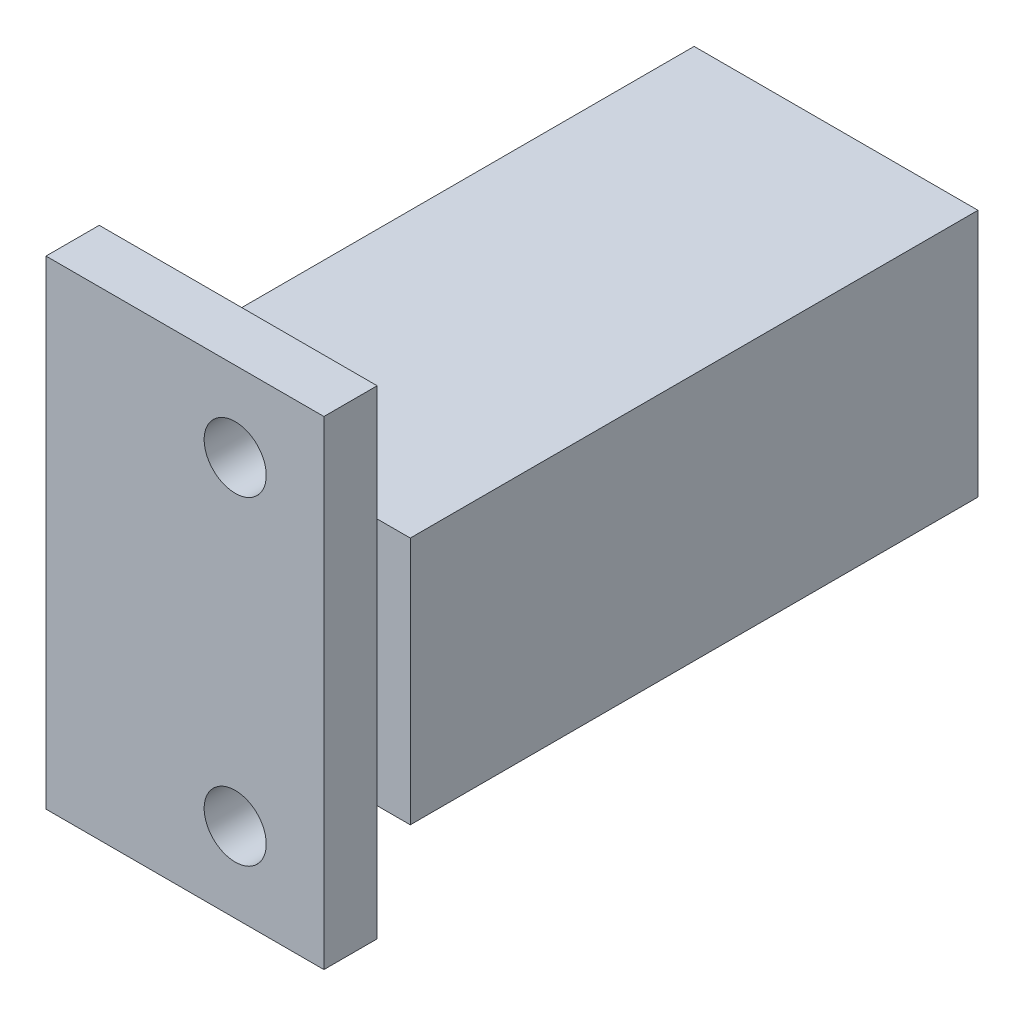
ISO-10303-21;
HEADER;
FILE_DESCRIPTION(('STEP AP214'),'2;1');
FILE_NAME('part.step','',(''),(''),'','','');
FILE_SCHEMA(('AUTOMOTIVE_DESIGN { 1 0 10303 214 1 1 1 1 }'));
ENDSEC;
DATA;
#1=APPLICATION_CONTEXT('core data for automotive mechanical design processes');
#2=APPLICATION_PROTOCOL_DEFINITION('international standard','automotive_design',2000,#1);
#3=PRODUCT_CONTEXT('',#1,'mechanical');
#4=PRODUCT('Part','Part','',(#3));
#5=PRODUCT_RELATED_PRODUCT_CATEGORY('part','',(#4));
#6=PRODUCT_DEFINITION_FORMATION('','',#4);
#7=PRODUCT_DEFINITION_CONTEXT('part definition',#1,'design');
#8=PRODUCT_DEFINITION('design','',#6,#7);
#9=PRODUCT_DEFINITION_SHAPE('','',#8);
#10=(LENGTH_UNIT() NAMED_UNIT(*) SI_UNIT(.MILLI.,.METRE.));
#11=(NAMED_UNIT(*) PLANE_ANGLE_UNIT() SI_UNIT($,.RADIAN.));
#12=(NAMED_UNIT(*) SI_UNIT($,.STERADIAN.) SOLID_ANGLE_UNIT());
#13=UNCERTAINTY_MEASURE_WITH_UNIT(LENGTH_MEASURE(1.E-05),#10,'distance_accuracy_value','');
#14=(GEOMETRIC_REPRESENTATION_CONTEXT(3) GLOBAL_UNCERTAINTY_ASSIGNED_CONTEXT((#13)) GLOBAL_UNIT_ASSIGNED_CONTEXT((#10,
#11,#12)) REPRESENTATION_CONTEXT('',''));
#15=CARTESIAN_POINT('',(0.,0.,0.));
#16=DIRECTION('',(0.,0.,1.));
#17=DIRECTION('',(1.,0.,0.));
#18=AXIS2_PLACEMENT_3D('',#15,#16,#17);
#19=CARTESIAN_POINT('',(14.1322640689648,-13.5,-8.001));
#20=DIRECTION('',(1.,0.,0.));
#21=DIRECTION('',(0.,0.,-1.));
#22=AXIS2_PLACEMENT_3D('',#19,#20,#21);
#23=PLANE('',#22);
#24=DIRECTION('',(0.,1.,0.));
#25=VECTOR('',#24,1.);
#26=CARTESIAN_POINT('',(14.1322640689648,-13.5,-8.001));
#27=LINE('',#26,#25);
#28=CARTESIAN_POINT('',(14.1322640689648,-13.5,-8.001));
#29=VERTEX_POINT('',#28);
#30=CARTESIAN_POINT('',(14.1322640689648,-7.,-8.001));
#31=VERTEX_POINT('',#30);
#32=EDGE_CURVE('E176',#29,#31,#27,.T.);
#33=ORIENTED_EDGE('',*,*,#32,.T.);
#34=DIRECTION('',(0.,0.,1.));
#35=VECTOR('',#34,1.);
#36=CARTESIAN_POINT('',(14.1322640689648,-7.,-8.001));
#37=LINE('',#36,#35);
#38=CARTESIAN_POINT('',(14.1322640689648,-7.,-8.));
#39=VERTEX_POINT('',#38);
#40=EDGE_CURVE('E63',#31,#39,#37,.T.);
#41=ORIENTED_EDGE('',*,*,#40,.T.);
#42=DIRECTION('',(0.,1.,0.));
#43=VECTOR('',#42,1.);
#44=CARTESIAN_POINT('',(14.1322640689648,-13.5,-8.));
#45=LINE('',#44,#43);
#46=CARTESIAN_POINT('',(14.1322640689648,7.,-8.));
#47=VERTEX_POINT('',#46);
#48=EDGE_CURVE('E47',#39,#47,#45,.T.);
#49=ORIENTED_EDGE('',*,*,#48,.T.);
#50=DIRECTION('',(0.,0.,-1.));
#51=VECTOR('',#50,1.);
#52=CARTESIAN_POINT('',(14.1322640689648,7.,-8.001));
#53=LINE('',#52,#51);
#54=CARTESIAN_POINT('',(14.1322640689648,7.,-8.001));
#55=VERTEX_POINT('',#54);
#56=EDGE_CURVE('E145',#47,#55,#53,.T.);
#57=ORIENTED_EDGE('',*,*,#56,.T.);
#58=CARTESIAN_POINT('',(14.1322640689648,13.5,-8.001));
#59=VERTEX_POINT('',#58);
#60=EDGE_CURVE('E175',#55,#59,#27,.T.);
#61=ORIENTED_EDGE('',*,*,#60,.T.);
#62=DIRECTION('',(0.,0.,1.));
#63=VECTOR('',#62,1.);
#64=CARTESIAN_POINT('',(14.1322640689648,13.5,-8.001));
#65=LINE('',#64,#63);
#66=CARTESIAN_POINT('',(14.1322640689648,13.5,-5.));
#67=VERTEX_POINT('',#66);
#68=EDGE_CURVE('E187',#59,#67,#65,.T.);
#69=ORIENTED_EDGE('',*,*,#68,.T.);
#70=DIRECTION('',(0.,1.,0.));
#71=VECTOR('',#70,1.);
#72=CARTESIAN_POINT('',(14.1322640689648,-13.5,-5.));
#73=LINE('',#72,#71);
#74=CARTESIAN_POINT('',(14.1322640689648,-13.5,-5.));
#75=VERTEX_POINT('',#74);
#76=EDGE_CURVE('E159',#75,#67,#73,.T.);
#77=ORIENTED_EDGE('',*,*,#76,.F.);
#78=DIRECTION('',(0.,0.,1.));
#79=VECTOR('',#78,1.);
#80=CARTESIAN_POINT('',(14.1322640689648,-13.5,-8.001));
#81=LINE('',#80,#79);
#82=EDGE_CURVE('E188',#29,#75,#81,.T.);
#83=ORIENTED_EDGE('',*,*,#82,.F.);
#84=EDGE_LOOP('',(#33,#41,#49,#57,#61,#69,#77,#83));
#85=FACE_BOUND('',#84,.T.);
#86=ADVANCED_FACE('F43',(#85),#23,.T.);
#87=CARTESIAN_POINT('',(0.,0.,-8.001));
#88=DIRECTION('',(0.,0.,1.));
#89=DIRECTION('',(1.,0.,0.));
#90=AXIS2_PLACEMENT_3D('',#87,#88,#89);
#91=PLANE('',#90);
#92=CARTESIAN_POINT('',(9.13226406896483,9.,-8.001));
#93=DIRECTION('',(0.,0.,1.));
#94=DIRECTION('',(1.,0.,0.));
#95=AXIS2_PLACEMENT_3D('',#92,#93,#94);
#96=CIRCLE('',#95,1.75);
#97=CARTESIAN_POINT('',(10.8822640689648,9.,-8.001));
#98=VERTEX_POINT('',#97);
#99=EDGE_CURVE('E172',#98,#98,#96,.T.);
#100=ORIENTED_EDGE('',*,*,#99,.T.);
#101=EDGE_LOOP('',(#100));
#102=FACE_BOUND('',#101,.T.);
#103=CARTESIAN_POINT('',(9.13226406896483,-9.,-8.001));
#104=DIRECTION('',(0.,0.,1.));
#105=DIRECTION('',(1.,0.,0.));
#106=AXIS2_PLACEMENT_3D('',#103,#104,#105);
#107=CIRCLE('',#106,1.75);
#108=CARTESIAN_POINT('',(10.8822640689648,-9.,-8.001));
#109=VERTEX_POINT('',#108);
#110=EDGE_CURVE('E169',#109,#109,#107,.T.);
#111=ORIENTED_EDGE('',*,*,#110,.T.);
#112=EDGE_LOOP('',(#111));
#113=FACE_BOUND('',#112,.T.);
#114=DIRECTION('',(-1.,0.,0.));
#115=VECTOR('',#114,1.);
#116=CARTESIAN_POINT('',(0.,-7.,-8.001));
#117=LINE('',#116,#115);
#118=CARTESIAN_POINT('',(0.,-7.00000000000001,-8.001));
#119=VERTEX_POINT('',#118);
#120=EDGE_CURVE('E203',#31,#119,#117,.T.);
#121=ORIENTED_EDGE('',*,*,#120,.F.);
#122=ORIENTED_EDGE('',*,*,#32,.F.);
#123=DIRECTION('',(1.,0.,0.));
#124=VECTOR('',#123,1.);
#125=CARTESIAN_POINT('',(14.1322640689648,-13.5,-8.001));
#126=LINE('',#125,#124);
#127=CARTESIAN_POINT('',(-1.53246556354501,-13.5,-8.001));
#128=VERTEX_POINT('',#127);
#129=EDGE_CURVE('E184',#128,#29,#126,.T.);
#130=ORIENTED_EDGE('',*,*,#129,.F.);
#131=DIRECTION('',(0.,-1.,0.));
#132=VECTOR('',#131,1.);
#133=CARTESIAN_POINT('',(-1.53246556354501,-13.5,-8.001));
#134=LINE('',#133,#132);
#135=CARTESIAN_POINT('',(-1.53246556354501,13.5,-8.001));
#136=VERTEX_POINT('',#135);
#137=EDGE_CURVE('E181',#136,#128,#134,.T.);
#138=ORIENTED_EDGE('',*,*,#137,.F.);
#139=DIRECTION('',(-1.,0.,0.));
#140=VECTOR('',#139,1.);
#141=CARTESIAN_POINT('',(14.1322640689648,13.5,-8.001));
#142=LINE('',#141,#140);
#143=EDGE_CURVE('E178',#59,#136,#142,.T.);
#144=ORIENTED_EDGE('',*,*,#143,.F.);
#145=ORIENTED_EDGE('',*,*,#60,.F.);
#146=DIRECTION('',(1.,0.,0.));
#147=VECTOR('',#146,1.);
#148=CARTESIAN_POINT('',(0.,7.,-8.001));
#149=LINE('',#148,#147);
#150=CARTESIAN_POINT('',(0.,7.,-8.001));
#151=VERTEX_POINT('',#150);
#152=EDGE_CURVE('E201',#151,#55,#149,.T.);
#153=ORIENTED_EDGE('',*,*,#152,.F.);
#154=DIRECTION('',(0.,1.,0.));
#155=VECTOR('',#154,1.);
#156=CARTESIAN_POINT('',(0.,0.,-8.001));
#157=LINE('',#156,#155);
#158=EDGE_CURVE('E191',#119,#151,#157,.T.);
#159=ORIENTED_EDGE('',*,*,#158,.F.);
#160=EDGE_LOOP('',(#121,#122,#130,#138,#144,#145,#153,#159));
#161=FACE_BOUND('',#160,.T.);
#162=ADVANCED_FACE('F230',(#102,#113,#161),#91,.F.);
#163=CARTESIAN_POINT('',(-1.5,13.5,8.));
#164=DIRECTION('',(0.,1.,0.));
#165=DIRECTION('',(0.,0.,1.));
#166=AXIS2_PLACEMENT_3D('',#163,#164,#165);
#167=PLANE('',#166);
#168=DIRECTION('',(-1.,0.,0.));
#169=VECTOR('',#168,1.);
#170=CARTESIAN_POINT('',(14.1322640689648,13.5,-5.));
#171=LINE('',#170,#169);
#172=CARTESIAN_POINT('',(-1.53246556354501,13.5,-5.));
#173=VERTEX_POINT('',#172);
#174=EDGE_CURVE('E162',#67,#173,#171,.T.);
#175=ORIENTED_EDGE('',*,*,#174,.F.);
#176=ORIENTED_EDGE('',*,*,#68,.F.);
#177=ORIENTED_EDGE('',*,*,#143,.T.);
#178=DIRECTION('',(0.,0.,1.));
#179=VECTOR('',#178,1.);
#180=CARTESIAN_POINT('',(-1.53246556354501,13.5,-8.001));
#181=LINE('',#180,#179);
#182=EDGE_CURVE('E194',#136,#173,#181,.T.);
#183=ORIENTED_EDGE('',*,*,#182,.T.);
#184=EDGE_LOOP('',(#175,#176,#177,#183));
#185=FACE_BOUND('',#184,.T.);
#186=ADVANCED_FACE('F45',(#185),#167,.T.);
#187=CARTESIAN_POINT('',(-1.5,-13.5,8.));
#188=DIRECTION('',(0.,-1.,0.));
#189=DIRECTION('',(0.,0.,-1.));
#190=AXIS2_PLACEMENT_3D('',#187,#188,#189);
#191=PLANE('',#190);
#192=ORIENTED_EDGE('',*,*,#82,.T.);
#193=DIRECTION('',(1.,0.,0.));
#194=VECTOR('',#193,1.);
#195=CARTESIAN_POINT('',(14.1322640689648,-13.5,-5.));
#196=LINE('',#195,#194);
#197=CARTESIAN_POINT('',(-1.53246556354501,-13.5,-5.));
#198=VERTEX_POINT('',#197);
#199=EDGE_CURVE('E167',#198,#75,#196,.T.);
#200=ORIENTED_EDGE('',*,*,#199,.F.);
#201=DIRECTION('',(0.,0.,1.));
#202=VECTOR('',#201,1.);
#203=CARTESIAN_POINT('',(-1.53246556354501,-13.5,-8.001));
#204=LINE('',#203,#202);
#205=EDGE_CURVE('E192',#128,#198,#204,.T.);
#206=ORIENTED_EDGE('',*,*,#205,.F.);
#207=ORIENTED_EDGE('',*,*,#129,.T.);
#208=EDGE_LOOP('',(#192,#200,#206,#207));
#209=FACE_BOUND('',#208,.T.);
#210=ADVANCED_FACE('F241',(#209),#191,.T.);
#211=CARTESIAN_POINT('',(0.,0.,-5.));
#212=DIRECTION('',(0.,0.,1.));
#213=DIRECTION('',(1.,0.,0.));
#214=AXIS2_PLACEMENT_3D('',#211,#212,#213);
#215=PLANE('',#214);
#216=ORIENTED_EDGE('',*,*,#199,.T.);
#217=ORIENTED_EDGE('',*,*,#76,.T.);
#218=ORIENTED_EDGE('',*,*,#174,.T.);
#219=DIRECTION('',(0.,-1.,0.));
#220=VECTOR('',#219,1.);
#221=CARTESIAN_POINT('',(-1.53246556354501,-13.5,-5.));
#222=LINE('',#221,#220);
#223=EDGE_CURVE('E164',#173,#198,#222,.T.);
#224=ORIENTED_EDGE('',*,*,#223,.T.);
#225=EDGE_LOOP('',(#216,#217,#218,#224));
#226=FACE_BOUND('',#225,.T.);
#227=CARTESIAN_POINT('',(9.13226406896483,9.,-5.));
#228=DIRECTION('',(0.,0.,1.));
#229=DIRECTION('',(1.,0.,0.));
#230=AXIS2_PLACEMENT_3D('',#227,#228,#229);
#231=CIRCLE('',#230,1.75);
#232=CARTESIAN_POINT('',(10.8822640689648,9.,-5.));
#233=VERTEX_POINT('',#232);
#234=EDGE_CURVE('E156',#233,#233,#231,.T.);
#235=ORIENTED_EDGE('',*,*,#234,.F.);
#236=EDGE_LOOP('',(#235));
#237=FACE_BOUND('',#236,.T.);
#238=CARTESIAN_POINT('',(9.13226406896483,-9.,-5.));
#239=DIRECTION('',(0.,0.,1.));
#240=DIRECTION('',(1.,0.,0.));
#241=AXIS2_PLACEMENT_3D('',#238,#239,#240);
#242=CIRCLE('',#241,1.75);
#243=CARTESIAN_POINT('',(10.8822640689648,-9.,-5.));
#244=VERTEX_POINT('',#243);
#245=EDGE_CURVE('E153',#244,#244,#242,.T.);
#246=ORIENTED_EDGE('',*,*,#245,.F.);
#247=EDGE_LOOP('',(#246));
#248=FACE_BOUND('',#247,.T.);
#249=ADVANCED_FACE('F237',(#226,#237,#248),#215,.T.);
#250=CARTESIAN_POINT('',(-1.53246556354501,-13.5,-8.001));
#251=DIRECTION('',(-1.,0.,0.));
#252=DIRECTION('',(0.,0.,1.));
#253=AXIS2_PLACEMENT_3D('',#250,#251,#252);
#254=PLANE('',#253);
#255=ORIENTED_EDGE('',*,*,#205,.T.);
#256=ORIENTED_EDGE('',*,*,#223,.F.);
#257=ORIENTED_EDGE('',*,*,#182,.F.);
#258=ORIENTED_EDGE('',*,*,#137,.T.);
#259=EDGE_LOOP('',(#255,#256,#257,#258));
#260=FACE_BOUND('',#259,.T.);
#261=ADVANCED_FACE('F243',(#260),#254,.T.);
#262=CARTESIAN_POINT('',(9.13226406896483,9.,-8.001));
#263=DIRECTION('',(0.,0.,1.));
#264=DIRECTION('',(1.,0.,0.));
#265=AXIS2_PLACEMENT_3D('',#262,#263,#264);
#266=CYLINDRICAL_SURFACE('',#265,1.75);
#267=ORIENTED_EDGE('',*,*,#99,.F.);
#268=EDGE_LOOP('',(#267));
#269=FACE_BOUND('',#268,.T.);
#270=ORIENTED_EDGE('',*,*,#234,.T.);
#271=EDGE_LOOP('',(#270));
#272=FACE_BOUND('',#271,.T.);
#273=ADVANCED_FACE('F245',(#269,#272),#266,.F.);
#274=CARTESIAN_POINT('',(9.13226406896483,-9.,-8.001));
#275=DIRECTION('',(0.,0.,1.));
#276=DIRECTION('',(1.,0.,0.));
#277=AXIS2_PLACEMENT_3D('',#274,#275,#276);
#278=CYLINDRICAL_SURFACE('',#277,1.75);
#279=ORIENTED_EDGE('',*,*,#110,.F.);
#280=EDGE_LOOP('',(#279));
#281=FACE_BOUND('',#280,.T.);
#282=ORIENTED_EDGE('',*,*,#245,.T.);
#283=EDGE_LOOP('',(#282));
#284=FACE_BOUND('',#283,.T.);
#285=ADVANCED_FACE('F251',(#281,#284),#278,.F.);
#286=CARTESIAN_POINT('',(0.,0.,0.));
#287=DIRECTION('',(1.,0.,0.));
#288=DIRECTION('',(0.,0.,-1.));
#289=AXIS2_PLACEMENT_3D('',#286,#287,#288);
#290=PLANE('',#289);
#291=DIRECTION('',(0.,0.,-1.));
#292=VECTOR('',#291,1.);
#293=CARTESIAN_POINT('',(0.,-7.,-8.));
#294=LINE('',#293,#292);
#295=CARTESIAN_POINT('',(0.,-7.00000000000001,-40.));
#296=VERTEX_POINT('',#295);
#297=EDGE_CURVE('E143',#119,#296,#294,.T.);
#298=ORIENTED_EDGE('',*,*,#297,.F.);
#299=ORIENTED_EDGE('',*,*,#158,.T.);
#300=DIRECTION('',(0.,0.,1.));
#301=VECTOR('',#300,1.);
#302=CARTESIAN_POINT('',(0.,7.,-8.));
#303=LINE('',#302,#301);
#304=CARTESIAN_POINT('',(0.,7.00000000000001,-40.));
#305=VERTEX_POINT('',#304);
#306=EDGE_CURVE('E138',#305,#151,#303,.T.);
#307=ORIENTED_EDGE('',*,*,#306,.F.);
#308=DIRECTION('',(0.,1.,0.));
#309=VECTOR('',#308,1.);
#310=CARTESIAN_POINT('',(0.,-7.00000000000001,-40.));
#311=LINE('',#310,#309);
#312=EDGE_CURVE('E210',#296,#305,#311,.T.);
#313=ORIENTED_EDGE('',*,*,#312,.F.);
#314=EDGE_LOOP('',(#298,#299,#307,#313));
#315=FACE_BOUND('',#314,.T.);
#316=ADVANCED_FACE('F207',(#315),#290,.F.);
#317=CARTESIAN_POINT('',(16.,-7.,-8.));
#318=DIRECTION('',(0.,1.,0.));
#319=DIRECTION('',(0.,0.,1.));
#320=AXIS2_PLACEMENT_3D('',#317,#318,#319);
#321=PLANE('',#320);
#322=ORIENTED_EDGE('',*,*,#40,.F.);
#323=ORIENTED_EDGE('',*,*,#120,.T.);
#324=ORIENTED_EDGE('',*,*,#297,.T.);
#325=DIRECTION('',(-1.,0.,0.));
#326=VECTOR('',#325,1.);
#327=CARTESIAN_POINT('',(16.,-7.00000000000001,-40.));
#328=LINE('',#327,#326);
#329=CARTESIAN_POINT('',(16.,-7.00000000000001,-40.));
#330=VERTEX_POINT('',#329);
#331=EDGE_CURVE('E123',#330,#296,#328,.T.);
#332=ORIENTED_EDGE('',*,*,#331,.F.);
#333=DIRECTION('',(0.,0.,-1.));
#334=VECTOR('',#333,1.);
#335=CARTESIAN_POINT('',(16.,-7.,-8.));
#336=LINE('',#335,#334);
#337=CARTESIAN_POINT('',(16.,-7.,-8.));
#338=VERTEX_POINT('',#337);
#339=EDGE_CURVE('E129',#338,#330,#336,.T.);
#340=ORIENTED_EDGE('',*,*,#339,.F.);
#341=DIRECTION('',(-1.,0.,0.));
#342=VECTOR('',#341,1.);
#343=CARTESIAN_POINT('',(16.,-7.,-8.));
#344=LINE('',#343,#342);
#345=EDGE_CURVE('E220',#338,#39,#344,.T.);
#346=ORIENTED_EDGE('',*,*,#345,.T.);
#347=EDGE_LOOP('',(#322,#323,#324,#332,#340,#346));
#348=FACE_BOUND('',#347,.T.);
#349=ADVANCED_FACE('F140',(#348),#321,.F.);
#350=CARTESIAN_POINT('',(16.,-7.00000000000001,-40.));
#351=DIRECTION('',(0.,0.,1.));
#352=DIRECTION('',(1.,0.,0.));
#353=AXIS2_PLACEMENT_3D('',#350,#351,#352);
#354=PLANE('',#353);
#355=CARTESIAN_POINT('',(9.,0.,-40.));
#356=DIRECTION('',(0.,0.,-1.));
#357=DIRECTION('',(-1.,0.,0.));
#358=AXIS2_PLACEMENT_3D('',#355,#356,#357);
#359=CIRCLE('',#358,2.5);
#360=CARTESIAN_POINT('',(6.5,0.,-40.));
#361=VERTEX_POINT('',#360);
#362=EDGE_CURVE('E11',#361,#361,#359,.T.);
#363=ORIENTED_EDGE('',*,*,#362,.F.);
#364=EDGE_LOOP('',(#363));
#365=FACE_BOUND('',#364,.T.);
#366=ORIENTED_EDGE('',*,*,#312,.T.);
#367=DIRECTION('',(-1.,0.,0.));
#368=VECTOR('',#367,1.);
#369=CARTESIAN_POINT('',(16.,7.00000000000001,-40.));
#370=LINE('',#369,#368);
#371=CARTESIAN_POINT('',(16.,7.00000000000001,-40.));
#372=VERTEX_POINT('',#371);
#373=EDGE_CURVE('E125',#372,#305,#370,.T.);
#374=ORIENTED_EDGE('',*,*,#373,.F.);
#375=DIRECTION('',(0.,1.,0.));
#376=VECTOR('',#375,1.);
#377=CARTESIAN_POINT('',(16.,-7.00000000000001,-40.));
#378=LINE('',#377,#376);
#379=EDGE_CURVE('E119',#330,#372,#378,.T.);
#380=ORIENTED_EDGE('',*,*,#379,.F.);
#381=ORIENTED_EDGE('',*,*,#331,.T.);
#382=EDGE_LOOP('',(#366,#374,#380,#381));
#383=FACE_BOUND('',#382,.T.);
#384=ADVANCED_FACE('F121',(#365,#383),#354,.F.);
#385=CARTESIAN_POINT('',(16.,7.,-8.));
#386=DIRECTION('',(0.,-1.,0.));
#387=DIRECTION('',(0.,0.,-1.));
#388=AXIS2_PLACEMENT_3D('',#385,#386,#387);
#389=PLANE('',#388);
#390=ORIENTED_EDGE('',*,*,#56,.F.);
#391=DIRECTION('',(-1.,0.,0.));
#392=VECTOR('',#391,1.);
#393=CARTESIAN_POINT('',(16.,7.,-8.));
#394=LINE('',#393,#392);
#395=CARTESIAN_POINT('',(16.,7.,-8.));
#396=VERTEX_POINT('',#395);
#397=EDGE_CURVE('E148',#396,#47,#394,.T.);
#398=ORIENTED_EDGE('',*,*,#397,.F.);
#399=DIRECTION('',(0.,0.,1.));
#400=VECTOR('',#399,1.);
#401=CARTESIAN_POINT('',(16.,7.,-8.));
#402=LINE('',#401,#400);
#403=EDGE_CURVE('E128',#372,#396,#402,.T.);
#404=ORIENTED_EDGE('',*,*,#403,.F.);
#405=ORIENTED_EDGE('',*,*,#373,.T.);
#406=ORIENTED_EDGE('',*,*,#306,.T.);
#407=ORIENTED_EDGE('',*,*,#152,.T.);
#408=EDGE_LOOP('',(#390,#398,#404,#405,#406,#407));
#409=FACE_BOUND('',#408,.T.);
#410=ADVANCED_FACE('F226',(#409),#389,.F.);
#411=CARTESIAN_POINT('',(16.,-7.,-8.));
#412=DIRECTION('',(0.,0.,-1.));
#413=DIRECTION('',(-1.,0.,0.));
#414=AXIS2_PLACEMENT_3D('',#411,#412,#413);
#415=PLANE('',#414);
#416=ORIENTED_EDGE('',*,*,#48,.F.);
#417=ORIENTED_EDGE('',*,*,#345,.F.);
#418=DIRECTION('',(0.,-1.,0.));
#419=VECTOR('',#418,1.);
#420=CARTESIAN_POINT('',(16.,-7.,-8.));
#421=LINE('',#420,#419);
#422=EDGE_CURVE('E134',#396,#338,#421,.T.);
#423=ORIENTED_EDGE('',*,*,#422,.F.);
#424=ORIENTED_EDGE('',*,*,#397,.T.);
#425=EDGE_LOOP('',(#416,#417,#423,#424));
#426=FACE_BOUND('',#425,.T.);
#427=ADVANCED_FACE('F224',(#426),#415,.F.);
#428=CARTESIAN_POINT('',(16.,0.,0.));
#429=DIRECTION('',(1.,0.,0.));
#430=DIRECTION('',(0.,0.,-1.));
#431=AXIS2_PLACEMENT_3D('',#428,#429,#430);
#432=PLANE('',#431);
#433=ORIENTED_EDGE('',*,*,#339,.T.);
#434=ORIENTED_EDGE('',*,*,#379,.T.);
#435=ORIENTED_EDGE('',*,*,#403,.T.);
#436=ORIENTED_EDGE('',*,*,#422,.T.);
#437=EDGE_LOOP('',(#433,#434,#435,#436));
#438=FACE_BOUND('',#437,.T.);
#439=ADVANCED_FACE('F132',(#438),#432,.T.);
#440=CARTESIAN_POINT('',(9.,0.,-40.));
#441=DIRECTION('',(0.,0.,1.));
#442=DIRECTION('',(-1.,0.,0.));
#443=AXIS2_PLACEMENT_3D('',#440,#441,#442);
#444=CONICAL_SURFACE('',#443,2.5,0.26179938779915);
#445=CARTESIAN_POINT('',(9.,0.,-44.));
#446=DIRECTION('',(0.,0.,-1.));
#447=DIRECTION('',(-1.,0.,0.));
#448=AXIS2_PLACEMENT_3D('',#445,#446,#447);
#449=CIRCLE('',#448,1.42820323027551);
#450=CARTESIAN_POINT('',(7.57179676972449,0.,-44.));
#451=VERTEX_POINT('',#450);
#452=EDGE_CURVE('E211',#451,#451,#449,.T.);
#453=ORIENTED_EDGE('',*,*,#452,.F.);
#454=EDGE_LOOP('',(#453));
#455=FACE_BOUND('',#454,.T.);
#456=ORIENTED_EDGE('',*,*,#362,.T.);
#457=EDGE_LOOP('',(#456));
#458=FACE_BOUND('',#457,.T.);
#459=ADVANCED_FACE('F277',(#455,#458),#444,.T.);
#460=CARTESIAN_POINT('',(9.,0.,-44.));
#461=DIRECTION('',(0.,0.,-1.));
#462=DIRECTION('',(-1.,0.,0.));
#463=AXIS2_PLACEMENT_3D('',#460,#461,#462);
#464=PLANE('',#463);
#465=ORIENTED_EDGE('',*,*,#452,.T.);
#466=EDGE_LOOP('',(#465));
#467=FACE_BOUND('',#466,.T.);
#468=ADVANCED_FACE('F273',(#467),#464,.T.);
#469=CLOSED_SHELL('',(#86,#162,#186,#210,#249,#261,#273,#285,#316,#349,#384,#410,#427,#439,#459,#468));
#470=MANIFOLD_SOLID_BREP('B2',#469);
#471=ADVANCED_BREP_SHAPE_REPRESENTATION('',(#18,#470),#14);
#472=SHAPE_DEFINITION_REPRESENTATION(#9,#471);
ENDSEC;
END-ISO-10303-21;
